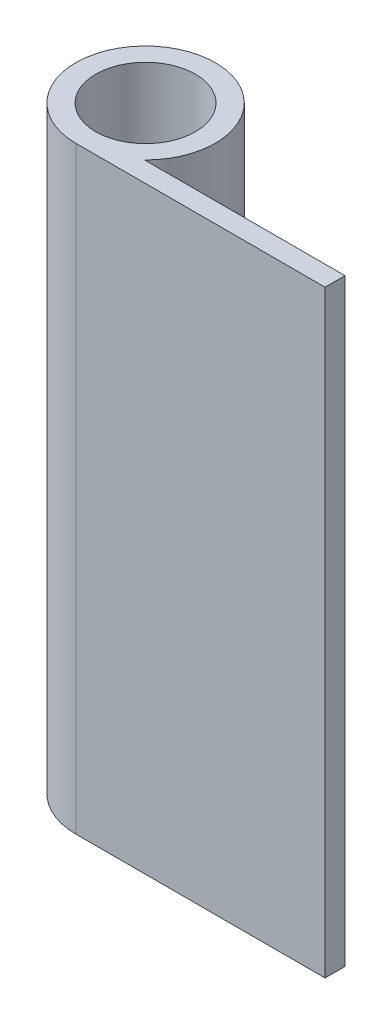
ISO-10303-21;
HEADER;
FILE_DESCRIPTION(('STEP AP214'),'2;1');
FILE_NAME('part.step','',(''),(''),'','','');
FILE_SCHEMA(('AUTOMOTIVE_DESIGN { 1 0 10303 214 1 1 1 1 }'));
ENDSEC;
DATA;
#1=APPLICATION_CONTEXT('core data for automotive mechanical design processes');
#2=APPLICATION_PROTOCOL_DEFINITION('international standard','automotive_design',2000,#1);
#3=PRODUCT_CONTEXT('',#1,'mechanical');
#4=PRODUCT('Part','Part','',(#3));
#5=PRODUCT_RELATED_PRODUCT_CATEGORY('part','',(#4));
#6=PRODUCT_DEFINITION_FORMATION('','',#4);
#7=PRODUCT_DEFINITION_CONTEXT('part definition',#1,'design');
#8=PRODUCT_DEFINITION('design','',#6,#7);
#9=PRODUCT_DEFINITION_SHAPE('','',#8);
#10=(LENGTH_UNIT() NAMED_UNIT(*) SI_UNIT(.MILLI.,.METRE.));
#11=(NAMED_UNIT(*) PLANE_ANGLE_UNIT() SI_UNIT($,.RADIAN.));
#12=(NAMED_UNIT(*) SI_UNIT($,.STERADIAN.) SOLID_ANGLE_UNIT());
#13=UNCERTAINTY_MEASURE_WITH_UNIT(LENGTH_MEASURE(1.E-05),#10,'distance_accuracy_value','');
#14=(GEOMETRIC_REPRESENTATION_CONTEXT(3) GLOBAL_UNCERTAINTY_ASSIGNED_CONTEXT((#13)) GLOBAL_UNIT_ASSIGNED_CONTEXT((#10,
#11,#12)) REPRESENTATION_CONTEXT('',''));
#15=CARTESIAN_POINT('',(0.,0.,0.));
#16=DIRECTION('',(0.,0.,1.));
#17=DIRECTION('',(1.,0.,0.));
#18=AXIS2_PLACEMENT_3D('',#15,#16,#17);
#19=CARTESIAN_POINT('',(0.,30.,0.));
#20=DIRECTION('',(0.,1.,0.));
#21=DIRECTION('',(0.,0.,1.));
#22=AXIS2_PLACEMENT_3D('',#19,#20,#21);
#23=PLANE('',#22);
#24=CARTESIAN_POINT('',(0.,30.,0.));
#25=DIRECTION('',(0.,1.,0.));
#26=DIRECTION('',(0.,0.,1.));
#27=AXIS2_PLACEMENT_3D('',#24,#25,#26);
#28=CIRCLE('',#27,7.);
#29=CARTESIAN_POINT('',(4.89897948556636,30.,4.99999999999989));
#30=VERTEX_POINT('',#29);
#31=CARTESIAN_POINT('',(0.,30.,6.9999999999999));
#32=VERTEX_POINT('',#31);
#33=EDGE_CURVE('E92',#30,#32,#28,.T.);
#34=ORIENTED_EDGE('',*,*,#33,.T.);
#35=DIRECTION('',(1.,0.,0.));
#36=VECTOR('',#35,1.);
#37=CARTESIAN_POINT('',(0.,30.,6.9999999999999));
#38=LINE('',#37,#36);
#39=CARTESIAN_POINT('',(25.,30.,6.9999999999999));
#40=VERTEX_POINT('',#39);
#41=EDGE_CURVE('E87',#32,#40,#38,.T.);
#42=ORIENTED_EDGE('',*,*,#41,.T.);
#43=DIRECTION('',(0.,0.,-1.));
#44=VECTOR('',#43,1.);
#45=CARTESIAN_POINT('',(25.,30.,6.9999999999999));
#46=LINE('',#45,#44);
#47=CARTESIAN_POINT('',(25.,30.,4.99999999999989));
#48=VERTEX_POINT('',#47);
#49=EDGE_CURVE('E90',#40,#48,#46,.T.);
#50=ORIENTED_EDGE('',*,*,#49,.T.);
#51=DIRECTION('',(-1.,0.,0.));
#52=VECTOR('',#51,1.);
#53=CARTESIAN_POINT('',(25.,30.,4.99999999999989));
#54=LINE('',#53,#52);
#55=EDGE_CURVE('E57',#48,#30,#54,.T.);
#56=ORIENTED_EDGE('',*,*,#55,.T.);
#57=EDGE_LOOP('',(#34,#42,#50,#56));
#58=FACE_BOUND('',#57,.T.);
#59=CARTESIAN_POINT('',(0.,30.,0.));
#60=DIRECTION('',(0.,1.,0.));
#61=DIRECTION('',(0.,0.,1.));
#62=AXIS2_PLACEMENT_3D('',#59,#60,#61);
#63=CIRCLE('',#62,5.);
#64=CARTESIAN_POINT('',(0.,30.,5.));
#65=VERTEX_POINT('',#64);
#66=EDGE_CURVE('E107',#65,#65,#63,.T.);
#67=ORIENTED_EDGE('',*,*,#66,.F.);
#68=EDGE_LOOP('',(#67));
#69=FACE_BOUND('',#68,.T.);
#70=ADVANCED_FACE('F40',(#58,#69),#23,.T.);
#71=CARTESIAN_POINT('',(0.,-30.,0.));
#72=DIRECTION('',(0.,1.,0.));
#73=DIRECTION('',(0.,0.,1.));
#74=AXIS2_PLACEMENT_3D('',#71,#72,#73);
#75=PLANE('',#74);
#76=CARTESIAN_POINT('',(0.,-30.,0.));
#77=DIRECTION('',(0.,1.,0.));
#78=DIRECTION('',(0.,0.,1.));
#79=AXIS2_PLACEMENT_3D('',#76,#77,#78);
#80=CIRCLE('',#79,7.);
#81=CARTESIAN_POINT('',(4.89897948556636,-30.,4.99999999999989));
#82=VERTEX_POINT('',#81);
#83=CARTESIAN_POINT('',(0.,-30.,6.9999999999999));
#84=VERTEX_POINT('',#83);
#85=EDGE_CURVE('E104',#82,#84,#80,.T.);
#86=ORIENTED_EDGE('',*,*,#85,.F.);
#87=DIRECTION('',(-1.,0.,0.));
#88=VECTOR('',#87,1.);
#89=CARTESIAN_POINT('',(25.,-30.,4.99999999999989));
#90=LINE('',#89,#88);
#91=CARTESIAN_POINT('',(25.,-30.,4.99999999999989));
#92=VERTEX_POINT('',#91);
#93=EDGE_CURVE('E80',#92,#82,#90,.T.);
#94=ORIENTED_EDGE('',*,*,#93,.F.);
#95=DIRECTION('',(0.,0.,-1.));
#96=VECTOR('',#95,1.);
#97=CARTESIAN_POINT('',(25.,-30.,6.9999999999999));
#98=LINE('',#97,#96);
#99=CARTESIAN_POINT('',(25.,-30.,6.9999999999999));
#100=VERTEX_POINT('',#99);
#101=EDGE_CURVE('E74',#100,#92,#98,.T.);
#102=ORIENTED_EDGE('',*,*,#101,.F.);
#103=DIRECTION('',(1.,0.,0.));
#104=VECTOR('',#103,1.);
#105=CARTESIAN_POINT('',(0.,-30.,6.9999999999999));
#106=LINE('',#105,#104);
#107=EDGE_CURVE('E96',#84,#100,#106,.T.);
#108=ORIENTED_EDGE('',*,*,#107,.F.);
#109=EDGE_LOOP('',(#86,#94,#102,#108));
#110=FACE_BOUND('',#109,.T.);
#111=CARTESIAN_POINT('',(0.,-30.,0.));
#112=DIRECTION('',(0.,1.,0.));
#113=DIRECTION('',(0.,0.,1.));
#114=AXIS2_PLACEMENT_3D('',#111,#112,#113);
#115=CIRCLE('',#114,5.);
#116=CARTESIAN_POINT('',(0.,-30.,5.));
#117=VERTEX_POINT('',#116);
#118=EDGE_CURVE('E119',#117,#117,#115,.T.);
#119=ORIENTED_EDGE('',*,*,#118,.T.);
#120=EDGE_LOOP('',(#119));
#121=FACE_BOUND('',#120,.T.);
#122=ADVANCED_FACE('F115',(#110,#121),#75,.F.);
#123=CARTESIAN_POINT('',(0.,30.,0.));
#124=DIRECTION('',(0.,-1.,0.));
#125=DIRECTION('',(0.,0.,-1.));
#126=AXIS2_PLACEMENT_3D('',#123,#124,#125);
#127=CYLINDRICAL_SURFACE('',#126,7.);
#128=ORIENTED_EDGE('',*,*,#85,.T.);
#129=DIRECTION('',(0.,-1.,0.));
#130=VECTOR('',#129,1.);
#131=CARTESIAN_POINT('',(0.,30.,6.9999999999999));
#132=LINE('',#131,#130);
#133=EDGE_CURVE('E13',#32,#84,#132,.T.);
#134=ORIENTED_EDGE('',*,*,#133,.F.);
#135=ORIENTED_EDGE('',*,*,#33,.F.);
#136=DIRECTION('',(0.,-1.,0.));
#137=VECTOR('',#136,1.);
#138=CARTESIAN_POINT('',(4.89897948556636,30.,4.99999999999989));
#139=LINE('',#138,#137);
#140=EDGE_CURVE('E100',#30,#82,#139,.T.);
#141=ORIENTED_EDGE('',*,*,#140,.T.);
#142=EDGE_LOOP('',(#128,#134,#135,#141));
#143=FACE_BOUND('',#142,.T.);
#144=ADVANCED_FACE('F42',(#143),#127,.T.);
#145=CARTESIAN_POINT('',(0.,30.,6.9999999999999));
#146=DIRECTION('',(0.,0.,-1.));
#147=DIRECTION('',(-1.,0.,0.));
#148=AXIS2_PLACEMENT_3D('',#145,#146,#147);
#149=PLANE('',#148);
#150=ORIENTED_EDGE('',*,*,#107,.T.);
#151=DIRECTION('',(0.,-1.,0.));
#152=VECTOR('',#151,1.);
#153=CARTESIAN_POINT('',(25.,30.,6.9999999999999));
#154=LINE('',#153,#152);
#155=EDGE_CURVE('E49',#40,#100,#154,.T.);
#156=ORIENTED_EDGE('',*,*,#155,.F.);
#157=ORIENTED_EDGE('',*,*,#41,.F.);
#158=ORIENTED_EDGE('',*,*,#133,.T.);
#159=EDGE_LOOP('',(#150,#156,#157,#158));
#160=FACE_BOUND('',#159,.T.);
#161=ADVANCED_FACE('F95',(#160),#149,.F.);
#162=CARTESIAN_POINT('',(25.,30.,6.9999999999999));
#163=DIRECTION('',(-1.,0.,0.));
#164=DIRECTION('',(0.,0.,1.));
#165=AXIS2_PLACEMENT_3D('',#162,#163,#164);
#166=PLANE('',#165);
#167=ORIENTED_EDGE('',*,*,#101,.T.);
#168=DIRECTION('',(0.,-1.,0.));
#169=VECTOR('',#168,1.);
#170=CARTESIAN_POINT('',(25.,30.,4.99999999999989));
#171=LINE('',#170,#169);
#172=EDGE_CURVE('E97',#48,#92,#171,.T.);
#173=ORIENTED_EDGE('',*,*,#172,.F.);
#174=ORIENTED_EDGE('',*,*,#49,.F.);
#175=ORIENTED_EDGE('',*,*,#155,.T.);
#176=EDGE_LOOP('',(#167,#173,#174,#175));
#177=FACE_BOUND('',#176,.T.);
#178=ADVANCED_FACE('F98',(#177),#166,.F.);
#179=CARTESIAN_POINT('',(25.,30.,4.99999999999989));
#180=DIRECTION('',(0.,0.,1.));
#181=DIRECTION('',(1.,0.,0.));
#182=AXIS2_PLACEMENT_3D('',#179,#180,#181);
#183=PLANE('',#182);
#184=ORIENTED_EDGE('',*,*,#93,.T.);
#185=ORIENTED_EDGE('',*,*,#140,.F.);
#186=ORIENTED_EDGE('',*,*,#55,.F.);
#187=ORIENTED_EDGE('',*,*,#172,.T.);
#188=EDGE_LOOP('',(#184,#185,#186,#187));
#189=FACE_BOUND('',#188,.T.);
#190=ADVANCED_FACE('F112',(#189),#183,.F.);
#191=CARTESIAN_POINT('',(0.,30.,0.));
#192=DIRECTION('',(0.,-1.,0.));
#193=DIRECTION('',(0.,0.,-1.));
#194=AXIS2_PLACEMENT_3D('',#191,#192,#193);
#195=CYLINDRICAL_SURFACE('',#194,5.);
#196=ORIENTED_EDGE('',*,*,#66,.T.);
#197=EDGE_LOOP('',(#196));
#198=FACE_BOUND('',#197,.T.);
#199=ORIENTED_EDGE('',*,*,#118,.F.);
#200=EDGE_LOOP('',(#199));
#201=FACE_BOUND('',#200,.T.);
#202=ADVANCED_FACE('F125',(#198,#201),#195,.F.);
#203=CLOSED_SHELL('',(#70,#122,#144,#161,#178,#190,#202));
#204=MANIFOLD_SOLID_BREP('B2',#203);
#205=ADVANCED_BREP_SHAPE_REPRESENTATION('',(#18,#204),#14);
#206=SHAPE_DEFINITION_REPRESENTATION(#9,#205);
ENDSEC;
END-ISO-10303-21;
